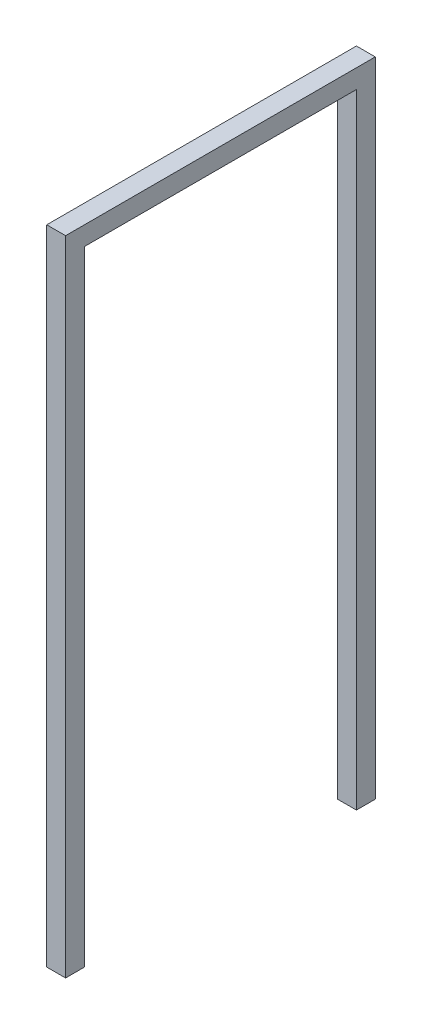
ISO-10303-21;
HEADER;
FILE_DESCRIPTION(('STEP AP214'),'2;1');
FILE_NAME('part.step','',(''),(''),'','','');
FILE_SCHEMA(('AUTOMOTIVE_DESIGN { 1 0 10303 214 1 1 1 1 }'));
ENDSEC;
DATA;
#1=APPLICATION_CONTEXT('core data for automotive mechanical design processes');
#2=APPLICATION_PROTOCOL_DEFINITION('international standard','automotive_design',2000,#1);
#3=PRODUCT_CONTEXT('',#1,'mechanical');
#4=PRODUCT('Part','Part','',(#3));
#5=PRODUCT_RELATED_PRODUCT_CATEGORY('part','',(#4));
#6=PRODUCT_DEFINITION_FORMATION('','',#4);
#7=PRODUCT_DEFINITION_CONTEXT('part definition',#1,'design');
#8=PRODUCT_DEFINITION('design','',#6,#7);
#9=PRODUCT_DEFINITION_SHAPE('','',#8);
#10=(LENGTH_UNIT() NAMED_UNIT(*) SI_UNIT(.MILLI.,.METRE.));
#11=(NAMED_UNIT(*) PLANE_ANGLE_UNIT() SI_UNIT($,.RADIAN.));
#12=(NAMED_UNIT(*) SI_UNIT($,.STERADIAN.) SOLID_ANGLE_UNIT());
#13=UNCERTAINTY_MEASURE_WITH_UNIT(LENGTH_MEASURE(1.E-05),#10,'distance_accuracy_value','');
#14=(GEOMETRIC_REPRESENTATION_CONTEXT(3) GLOBAL_UNCERTAINTY_ASSIGNED_CONTEXT((#13)) GLOBAL_UNIT_ASSIGNED_CONTEXT((#10,
#11,#12)) REPRESENTATION_CONTEXT('',''));
#15=CARTESIAN_POINT('',(0.,0.,0.));
#16=DIRECTION('',(0.,0.,1.));
#17=DIRECTION('',(1.,0.,0.));
#18=AXIS2_PLACEMENT_3D('',#15,#16,#17);
#19=CARTESIAN_POINT('',(0.,2600.,76.2));
#20=DIRECTION('',(0.,0.,-1.));
#21=DIRECTION('',(-1.,0.,0.));
#22=AXIS2_PLACEMENT_3D('',#19,#20,#21);
#23=PLANE('',#22);
#24=DIRECTION('',(1.,0.,0.));
#25=VECTOR('',#24,1.);
#26=CARTESIAN_POINT('',(0.,2523.8,76.2));
#27=LINE('',#26,#25);
#28=CARTESIAN_POINT('',(0.,2523.8,76.2));
#29=VERTEX_POINT('',#28);
#30=CARTESIAN_POINT('',(76.2,2523.8,76.2));
#31=VERTEX_POINT('',#30);
#32=EDGE_CURVE('E51',#29,#31,#27,.T.);
#33=ORIENTED_EDGE('',*,*,#32,.F.);
#34=DIRECTION('',(0.,-1.,0.));
#35=VECTOR('',#34,1.);
#36=CARTESIAN_POINT('',(0.,2600.,76.2));
#37=LINE('',#36,#35);
#38=CARTESIAN_POINT('',(0.,0.,76.2));
#39=VERTEX_POINT('',#38);
#40=EDGE_CURVE('E11',#29,#39,#37,.T.);
#41=ORIENTED_EDGE('',*,*,#40,.T.);
#42=DIRECTION('',(1.,0.,0.));
#43=VECTOR('',#42,1.);
#44=CARTESIAN_POINT('',(0.,0.,76.2));
#45=LINE('',#44,#43);
#46=CARTESIAN_POINT('',(76.2,0.,76.2));
#47=VERTEX_POINT('',#46);
#48=EDGE_CURVE('E99',#39,#47,#45,.T.);
#49=ORIENTED_EDGE('',*,*,#48,.T.);
#50=DIRECTION('',(0.,-1.,0.));
#51=VECTOR('',#50,1.);
#52=CARTESIAN_POINT('',(76.2,2600.,76.2));
#53=LINE('',#52,#51);
#54=EDGE_CURVE('E45',#31,#47,#53,.T.);
#55=ORIENTED_EDGE('',*,*,#54,.F.);
#56=EDGE_LOOP('',(#33,#41,#49,#55));
#57=FACE_BOUND('',#56,.T.);
#58=ADVANCED_FACE('F37',(#57),#23,.F.);
#59=CARTESIAN_POINT('',(0.,2600.,0.));
#60=DIRECTION('',(1.,0.,0.));
#61=DIRECTION('',(0.,0.,-1.));
#62=AXIS2_PLACEMENT_3D('',#59,#60,#61);
#63=PLANE('',#62);
#64=DIRECTION('',(0.,0.,1.));
#65=VECTOR('',#64,1.);
#66=CARTESIAN_POINT('',(0.,0.,0.));
#67=LINE('',#66,#65);
#68=CARTESIAN_POINT('',(0.,0.,0.));
#69=VERTEX_POINT('',#68);
#70=EDGE_CURVE('E93',#69,#39,#67,.T.);
#71=ORIENTED_EDGE('',*,*,#70,.T.);
#72=ORIENTED_EDGE('',*,*,#40,.F.);
#73=DIRECTION('',(0.,0.,-1.));
#74=VECTOR('',#73,1.);
#75=CARTESIAN_POINT('',(0.,2523.8,1283.96307345283));
#76=LINE('',#75,#74);
#77=CARTESIAN_POINT('',(0.,2523.8,1176.2));
#78=VERTEX_POINT('',#77);
#79=EDGE_CURVE('E119',#78,#29,#76,.T.);
#80=ORIENTED_EDGE('',*,*,#79,.F.);
#81=DIRECTION('',(0.,-1.,0.));
#82=VECTOR('',#81,1.);
#83=CARTESIAN_POINT('',(0.,2600.,1176.2));
#84=LINE('',#83,#82);
#85=CARTESIAN_POINT('',(0.,0.,1176.2));
#86=VERTEX_POINT('',#85);
#87=EDGE_CURVE('E162',#78,#86,#84,.T.);
#88=ORIENTED_EDGE('',*,*,#87,.T.);
#89=DIRECTION('',(0.,0.,1.));
#90=VECTOR('',#89,1.);
#91=CARTESIAN_POINT('',(0.,0.,1252.4));
#92=LINE('',#91,#90);
#93=CARTESIAN_POINT('',(0.,0.,1252.4));
#94=VERTEX_POINT('',#93);
#95=EDGE_CURVE('E171',#86,#94,#92,.T.);
#96=ORIENTED_EDGE('',*,*,#95,.T.);
#97=DIRECTION('',(0.,-1.,0.));
#98=VECTOR('',#97,1.);
#99=CARTESIAN_POINT('',(0.,2600.,1252.4));
#100=LINE('',#99,#98);
#101=CARTESIAN_POINT('',(0.,2600.,1252.4));
#102=VERTEX_POINT('',#101);
#103=EDGE_CURVE('E166',#102,#94,#100,.T.);
#104=ORIENTED_EDGE('',*,*,#103,.F.);
#105=DIRECTION('',(0.,0.,1.));
#106=VECTOR('',#105,1.);
#107=CARTESIAN_POINT('',(0.,2600.,0.));
#108=LINE('',#107,#106);
#109=CARTESIAN_POINT('',(0.,2600.,0.));
#110=VERTEX_POINT('',#109);
#111=EDGE_CURVE('E88',#110,#102,#108,.T.);
#112=ORIENTED_EDGE('',*,*,#111,.F.);
#113=DIRECTION('',(0.,-1.,0.));
#114=VECTOR('',#113,1.);
#115=CARTESIAN_POINT('',(0.,2600.,0.));
#116=LINE('',#115,#114);
#117=EDGE_CURVE('E81',#110,#69,#116,.T.);
#118=ORIENTED_EDGE('',*,*,#117,.T.);
#119=EDGE_LOOP('',(#71,#72,#80,#88,#96,#104,#112,#118));
#120=FACE_BOUND('',#119,.T.);
#121=ADVANCED_FACE('F39',(#120),#63,.F.);
#122=CARTESIAN_POINT('',(76.2,2600.,0.));
#123=DIRECTION('',(-1.,0.,0.));
#124=DIRECTION('',(0.,0.,1.));
#125=AXIS2_PLACEMENT_3D('',#122,#123,#124);
#126=PLANE('',#125);
#127=DIRECTION('',(0.,0.,-1.));
#128=VECTOR('',#127,1.);
#129=CARTESIAN_POINT('',(76.2,0.,0.));
#130=LINE('',#129,#128);
#131=CARTESIAN_POINT('',(76.2,0.,0.));
#132=VERTEX_POINT('',#131);
#133=EDGE_CURVE('E89',#47,#132,#130,.T.);
#134=ORIENTED_EDGE('',*,*,#133,.T.);
#135=DIRECTION('',(0.,-1.,0.));
#136=VECTOR('',#135,1.);
#137=CARTESIAN_POINT('',(76.2,2600.,0.));
#138=LINE('',#137,#136);
#139=CARTESIAN_POINT('',(76.2,2600.,0.));
#140=VERTEX_POINT('',#139);
#141=EDGE_CURVE('E84',#140,#132,#138,.T.);
#142=ORIENTED_EDGE('',*,*,#141,.F.);
#143=DIRECTION('',(0.,0.,-1.));
#144=VECTOR('',#143,1.);
#145=CARTESIAN_POINT('',(76.2,2600.,0.));
#146=LINE('',#145,#144);
#147=CARTESIAN_POINT('',(76.2,2600.,1252.4));
#148=VERTEX_POINT('',#147);
#149=EDGE_CURVE('E132',#148,#140,#146,.T.);
#150=ORIENTED_EDGE('',*,*,#149,.F.);
#151=DIRECTION('',(0.,-1.,0.));
#152=VECTOR('',#151,1.);
#153=CARTESIAN_POINT('',(76.2,2600.,1252.4));
#154=LINE('',#153,#152);
#155=CARTESIAN_POINT('',(76.2,0.,1252.4));
#156=VERTEX_POINT('',#155);
#157=EDGE_CURVE('E124',#148,#156,#154,.T.);
#158=ORIENTED_EDGE('',*,*,#157,.T.);
#159=DIRECTION('',(0.,0.,-1.));
#160=VECTOR('',#159,1.);
#161=CARTESIAN_POINT('',(76.2,0.,1252.4));
#162=LINE('',#161,#160);
#163=CARTESIAN_POINT('',(76.2,0.,1176.2));
#164=VERTEX_POINT('',#163);
#165=EDGE_CURVE('E163',#156,#164,#162,.T.);
#166=ORIENTED_EDGE('',*,*,#165,.T.);
#167=DIRECTION('',(0.,-1.,0.));
#168=VECTOR('',#167,1.);
#169=CARTESIAN_POINT('',(76.2,2600.,1176.2));
#170=LINE('',#169,#168);
#171=CARTESIAN_POINT('',(76.2,2523.8,1176.2));
#172=VERTEX_POINT('',#171);
#173=EDGE_CURVE('E128',#172,#164,#170,.T.);
#174=ORIENTED_EDGE('',*,*,#173,.F.);
#175=DIRECTION('',(0.,0.,-1.));
#176=VECTOR('',#175,1.);
#177=CARTESIAN_POINT('',(76.2,2523.8,1283.96307345283));
#178=LINE('',#177,#176);
#179=EDGE_CURVE('E104',#172,#31,#178,.T.);
#180=ORIENTED_EDGE('',*,*,#179,.T.);
#181=ORIENTED_EDGE('',*,*,#54,.T.);
#182=EDGE_LOOP('',(#134,#142,#150,#158,#166,#174,#180,#181));
#183=FACE_BOUND('',#182,.T.);
#184=ADVANCED_FACE('F112',(#183),#126,.F.);
#185=CARTESIAN_POINT('',(0.,2600.,0.));
#186=DIRECTION('',(0.,0.,1.));
#187=DIRECTION('',(1.,0.,0.));
#188=AXIS2_PLACEMENT_3D('',#185,#186,#187);
#189=PLANE('',#188);
#190=DIRECTION('',(-1.,0.,0.));
#191=VECTOR('',#190,1.);
#192=CARTESIAN_POINT('',(0.,0.,0.));
#193=LINE('',#192,#191);
#194=EDGE_CURVE('E78',#132,#69,#193,.T.);
#195=ORIENTED_EDGE('',*,*,#194,.T.);
#196=ORIENTED_EDGE('',*,*,#117,.F.);
#197=DIRECTION('',(-1.,0.,0.));
#198=VECTOR('',#197,1.);
#199=CARTESIAN_POINT('',(0.,2600.,0.));
#200=LINE('',#199,#198);
#201=EDGE_CURVE('E60',#140,#110,#200,.T.);
#202=ORIENTED_EDGE('',*,*,#201,.F.);
#203=ORIENTED_EDGE('',*,*,#141,.T.);
#204=EDGE_LOOP('',(#195,#196,#202,#203));
#205=FACE_BOUND('',#204,.T.);
#206=ADVANCED_FACE('F80',(#205),#189,.F.);
#207=CARTESIAN_POINT('',(0.,2600.,0.));
#208=DIRECTION('',(0.,1.,0.));
#209=DIRECTION('',(0.,0.,1.));
#210=AXIS2_PLACEMENT_3D('',#207,#208,#209);
#211=PLANE('',#210);
#212=ORIENTED_EDGE('',*,*,#111,.T.);
#213=DIRECTION('',(1.,0.,0.));
#214=VECTOR('',#213,1.);
#215=CARTESIAN_POINT('',(0.,2600.,1252.4));
#216=LINE('',#215,#214);
#217=EDGE_CURVE('E138',#102,#148,#216,.T.);
#218=ORIENTED_EDGE('',*,*,#217,.T.);
#219=ORIENTED_EDGE('',*,*,#149,.T.);
#220=ORIENTED_EDGE('',*,*,#201,.T.);
#221=EDGE_LOOP('',(#212,#218,#219,#220));
#222=FACE_BOUND('',#221,.T.);
#223=ADVANCED_FACE('F135',(#222),#211,.T.);
#224=CARTESIAN_POINT('',(0.,0.,0.));
#225=DIRECTION('',(0.,1.,0.));
#226=DIRECTION('',(0.,0.,1.));
#227=AXIS2_PLACEMENT_3D('',#224,#225,#226);
#228=PLANE('',#227);
#229=ORIENTED_EDGE('',*,*,#70,.F.);
#230=ORIENTED_EDGE('',*,*,#194,.F.);
#231=ORIENTED_EDGE('',*,*,#133,.F.);
#232=ORIENTED_EDGE('',*,*,#48,.F.);
#233=EDGE_LOOP('',(#229,#230,#231,#232));
#234=FACE_BOUND('',#233,.T.);
#235=ADVANCED_FACE('F97',(#234),#228,.F.);
#236=CARTESIAN_POINT('',(0.,2523.8,1283.96307345283));
#237=DIRECTION('',(0.,1.,0.));
#238=DIRECTION('',(0.,0.,1.));
#239=AXIS2_PLACEMENT_3D('',#236,#237,#238);
#240=PLANE('',#239);
#241=DIRECTION('',(1.,0.,0.));
#242=VECTOR('',#241,1.);
#243=CARTESIAN_POINT('',(0.,2523.8,1176.2));
#244=LINE('',#243,#242);
#245=EDGE_CURVE('E100',#78,#172,#244,.T.);
#246=ORIENTED_EDGE('',*,*,#245,.F.);
#247=ORIENTED_EDGE('',*,*,#79,.T.);
#248=ORIENTED_EDGE('',*,*,#32,.T.);
#249=ORIENTED_EDGE('',*,*,#179,.F.);
#250=EDGE_LOOP('',(#246,#247,#248,#249));
#251=FACE_BOUND('',#250,.T.);
#252=ADVANCED_FACE('F123',(#251),#240,.F.);
#253=CARTESIAN_POINT('',(0.,2600.,1176.2));
#254=DIRECTION('',(0.,0.,1.));
#255=DIRECTION('',(1.,0.,0.));
#256=AXIS2_PLACEMENT_3D('',#253,#254,#255);
#257=PLANE('',#256);
#258=ORIENTED_EDGE('',*,*,#87,.F.);
#259=ORIENTED_EDGE('',*,*,#245,.T.);
#260=ORIENTED_EDGE('',*,*,#173,.T.);
#261=DIRECTION('',(-1.,0.,0.));
#262=VECTOR('',#261,1.);
#263=CARTESIAN_POINT('',(0.,0.,1176.2));
#264=LINE('',#263,#262);
#265=EDGE_CURVE('E173',#164,#86,#264,.T.);
#266=ORIENTED_EDGE('',*,*,#265,.T.);
#267=EDGE_LOOP('',(#258,#259,#260,#266));
#268=FACE_BOUND('',#267,.T.);
#269=ADVANCED_FACE('F160',(#268),#257,.F.);
#270=CARTESIAN_POINT('',(0.,2600.,1252.4));
#271=DIRECTION('',(0.,0.,-1.));
#272=DIRECTION('',(-1.,0.,0.));
#273=AXIS2_PLACEMENT_3D('',#270,#271,#272);
#274=PLANE('',#273);
#275=DIRECTION('',(1.,0.,0.));
#276=VECTOR('',#275,1.);
#277=CARTESIAN_POINT('',(0.,0.,1252.4));
#278=LINE('',#277,#276);
#279=EDGE_CURVE('E176',#94,#156,#278,.T.);
#280=ORIENTED_EDGE('',*,*,#279,.T.);
#281=ORIENTED_EDGE('',*,*,#157,.F.);
#282=ORIENTED_EDGE('',*,*,#217,.F.);
#283=ORIENTED_EDGE('',*,*,#103,.T.);
#284=EDGE_LOOP('',(#280,#281,#282,#283));
#285=FACE_BOUND('',#284,.T.);
#286=ADVANCED_FACE('F180',(#285),#274,.F.);
#287=CARTESIAN_POINT('',(0.,0.,0.));
#288=DIRECTION('',(0.,1.,0.));
#289=DIRECTION('',(0.,0.,1.));
#290=AXIS2_PLACEMENT_3D('',#287,#288,#289);
#291=PLANE('',#290);
#292=ORIENTED_EDGE('',*,*,#279,.F.);
#293=ORIENTED_EDGE('',*,*,#95,.F.);
#294=ORIENTED_EDGE('',*,*,#265,.F.);
#295=ORIENTED_EDGE('',*,*,#165,.F.);
#296=EDGE_LOOP('',(#292,#293,#294,#295));
#297=FACE_BOUND('',#296,.T.);
#298=ADVANCED_FACE('F183',(#297),#291,.F.);
#299=CLOSED_SHELL('',(#58,#121,#184,#206,#223,#235,#252,#269,#286,#298));
#300=MANIFOLD_SOLID_BREP('B2',#299);
#301=ADVANCED_BREP_SHAPE_REPRESENTATION('',(#18,#300),#14);
#302=SHAPE_DEFINITION_REPRESENTATION(#9,#301);
ENDSEC;
END-ISO-10303-21;
